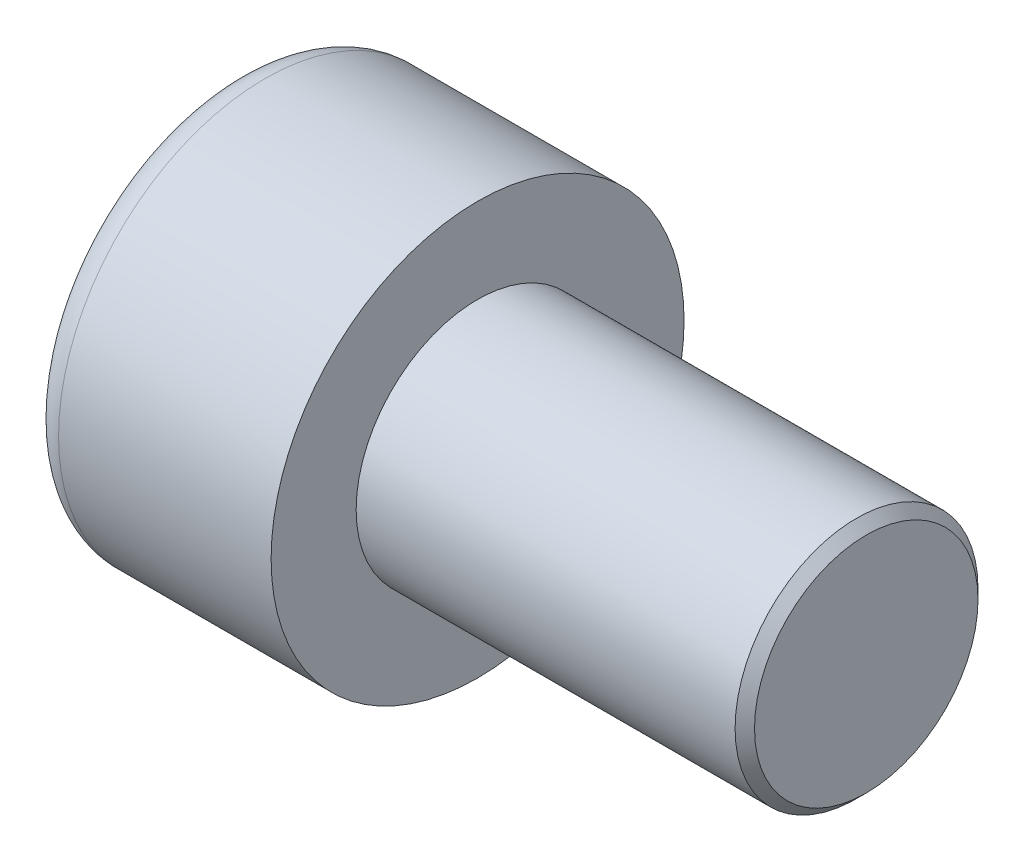
ISO-10303-21;
HEADER;
FILE_DESCRIPTION(('STEP AP214'),'2;1');
FILE_NAME('part.step','',(''),(''),'','','');
FILE_SCHEMA(('AUTOMOTIVE_DESIGN { 1 0 10303 214 1 1 1 1 }'));
ENDSEC;
DATA;
#1=APPLICATION_CONTEXT('core data for automotive mechanical design processes');
#2=APPLICATION_PROTOCOL_DEFINITION('international standard','automotive_design',2000,#1);
#3=PRODUCT_CONTEXT('',#1,'mechanical');
#4=PRODUCT('Part','Part','',(#3));
#5=PRODUCT_RELATED_PRODUCT_CATEGORY('part','',(#4));
#6=PRODUCT_DEFINITION_FORMATION('','',#4);
#7=PRODUCT_DEFINITION_CONTEXT('part definition',#1,'design');
#8=PRODUCT_DEFINITION('design','',#6,#7);
#9=PRODUCT_DEFINITION_SHAPE('','',#8);
#10=(LENGTH_UNIT() NAMED_UNIT(*) SI_UNIT(.MILLI.,.METRE.));
#11=(NAMED_UNIT(*) PLANE_ANGLE_UNIT() SI_UNIT($,.RADIAN.));
#12=(NAMED_UNIT(*) SI_UNIT($,.STERADIAN.) SOLID_ANGLE_UNIT());
#13=UNCERTAINTY_MEASURE_WITH_UNIT(LENGTH_MEASURE(1.E-05),#10,'distance_accuracy_value','');
#14=(GEOMETRIC_REPRESENTATION_CONTEXT(3) GLOBAL_UNCERTAINTY_ASSIGNED_CONTEXT((#13)) GLOBAL_UNIT_ASSIGNED_CONTEXT((#10,
#11,#12)) REPRESENTATION_CONTEXT('',''));
#15=CARTESIAN_POINT('',(0.,0.,0.));
#16=DIRECTION('',(0.,0.,1.));
#17=DIRECTION('',(1.,0.,0.));
#18=AXIS2_PLACEMENT_3D('',#15,#16,#17);
#19=CARTESIAN_POINT('',(2.5,0.,-2.3094010767585));
#20=DIRECTION('',(1.,0.,0.));
#21=DIRECTION('',(0.,0.,-1.));
#22=AXIS2_PLACEMENT_3D('',#19,#20,#21);
#23=PLANE('',#22);
#24=DIRECTION('',(0.,0.,-1.));
#25=VECTOR('',#24,1.);
#26=CARTESIAN_POINT('',(2.5,2.,-2.3094010767585));
#27=LINE('',#26,#25);
#28=CARTESIAN_POINT('',(2.5,2.,-1.15470053837925));
#29=VERTEX_POINT('',#28);
#30=CARTESIAN_POINT('',(2.49999999999886,2.00000000000477,0.));
#31=VERTEX_POINT('',#30);
#32=EDGE_CURVE('E80',#29,#31,#27,.F.);
#33=ORIENTED_EDGE('',*,*,#32,.F.);
#34=DIRECTION('',(0.,0.866025403784438,0.5));
#35=VECTOR('',#34,1.);
#36=CARTESIAN_POINT('',(2.5,1.,-1.73205080756888));
#37=LINE('',#36,#35);
#38=CARTESIAN_POINT('',(2.49999999999886,1.00000000000239,-1.73205080757301));
#39=VERTEX_POINT('',#38);
#40=EDGE_CURVE('E103',#39,#29,#37,.T.);
#41=ORIENTED_EDGE('',*,*,#40,.F.);
#42=CARTESIAN_POINT('',(2.49999999999773,0.,0.));
#43=DIRECTION('',(-1.,0.,0.));
#44=DIRECTION('',(0.,0.,1.));
#45=AXIS2_PLACEMENT_3D('',#42,#43,#44);
#46=CIRCLE('',#45,2.00000000000955);
#47=EDGE_CURVE('E111',#39,#31,#46,.F.);
#48=ORIENTED_EDGE('',*,*,#47,.T.);
#49=EDGE_LOOP('',(#33,#41,#48));
#50=FACE_BOUND('',#49,.T.);
#51=ADVANCED_FACE('F16',(#50),#23,.F.);
#52=CARTESIAN_POINT('',(2.5,0.,-2.3094010767585));
#53=DIRECTION('',(1.,0.,0.));
#54=DIRECTION('',(0.,0.,-1.));
#55=AXIS2_PLACEMENT_3D('',#52,#53,#54);
#56=PLANE('',#55);
#57=DIRECTION('',(0.,-0.866025403784439,0.5));
#58=VECTOR('',#57,1.);
#59=CARTESIAN_POINT('',(2.5,2.,1.15470053837925));
#60=LINE('',#59,#58);
#61=CARTESIAN_POINT('',(2.5,2.,1.15470053837925));
#62=VERTEX_POINT('',#61);
#63=CARTESIAN_POINT('',(2.49999999999886,1.00000000000239,1.73205080757301));
#64=VERTEX_POINT('',#63);
#65=EDGE_CURVE('E278',#62,#64,#60,.T.);
#66=ORIENTED_EDGE('',*,*,#65,.F.);
#67=DIRECTION('',(0.,0.,-1.));
#68=VECTOR('',#67,1.);
#69=CARTESIAN_POINT('',(2.5,2.,-2.3094010767585));
#70=LINE('',#69,#68);
#71=EDGE_CURVE('E282',#31,#62,#70,.F.);
#72=ORIENTED_EDGE('',*,*,#71,.F.);
#73=CARTESIAN_POINT('',(2.49999999999773,0.,0.));
#74=DIRECTION('',(-1.,0.,0.));
#75=DIRECTION('',(0.,0.,1.));
#76=AXIS2_PLACEMENT_3D('',#73,#74,#75);
#77=CIRCLE('',#76,2.00000000000955);
#78=EDGE_CURVE('E117',#31,#64,#77,.F.);
#79=ORIENTED_EDGE('',*,*,#78,.T.);
#80=EDGE_LOOP('',(#66,#72,#79));
#81=FACE_BOUND('',#80,.T.);
#82=ADVANCED_FACE('F323',(#81),#56,.F.);
#83=CARTESIAN_POINT('',(2.5,0.,-2.3094010767585));
#84=DIRECTION('',(1.,0.,0.));
#85=DIRECTION('',(0.,0.,-1.));
#86=AXIS2_PLACEMENT_3D('',#83,#84,#85);
#87=PLANE('',#86);
#88=DIRECTION('',(0.,0.866025403784439,-0.5));
#89=VECTOR('',#88,1.);
#90=CARTESIAN_POINT('',(2.5,-2.,-1.15470053837925));
#91=LINE('',#90,#89);
#92=CARTESIAN_POINT('',(2.5,-2.,-1.15470053837925));
#93=VERTEX_POINT('',#92);
#94=CARTESIAN_POINT('',(2.49999999999886,-1.00000000000239,-1.73205080757301));
#95=VERTEX_POINT('',#94);
#96=EDGE_CURVE('E118',#93,#95,#91,.T.);
#97=ORIENTED_EDGE('',*,*,#96,.F.);
#98=DIRECTION('',(0.,0.,-1.));
#99=VECTOR('',#98,1.);
#100=CARTESIAN_POINT('',(2.5,-2.,-2.3094010767585));
#101=LINE('',#100,#99);
#102=CARTESIAN_POINT('',(2.49999999999886,-2.00000000000477,0.));
#103=VERTEX_POINT('',#102);
#104=EDGE_CURVE('E122',#103,#93,#101,.T.);
#105=ORIENTED_EDGE('',*,*,#104,.F.);
#106=CARTESIAN_POINT('',(2.49999999999773,0.,0.));
#107=DIRECTION('',(-1.,0.,0.));
#108=DIRECTION('',(0.,0.,1.));
#109=AXIS2_PLACEMENT_3D('',#106,#107,#108);
#110=CIRCLE('',#109,2.00000000000955);
#111=EDGE_CURVE('E97',#103,#95,#110,.F.);
#112=ORIENTED_EDGE('',*,*,#111,.T.);
#113=EDGE_LOOP('',(#97,#105,#112));
#114=FACE_BOUND('',#113,.T.);
#115=ADVANCED_FACE('F335',(#114),#87,.F.);
#116=CARTESIAN_POINT('',(2.49999999999773,0.,0.));
#117=DIRECTION('',(-1.,0.,0.));
#118=DIRECTION('',(0.,0.,1.));
#119=AXIS2_PLACEMENT_3D('',#116,#117,#118);
#120=CONICAL_SURFACE('',#119,2.00000000000955,1.04719755114751);
#121=CARTESIAN_POINT('',(3.65470053836248,0.,0.));
#122=VERTEX_POINT('',#121);
#123=VERTEX_LOOP('',#122);
#124=FACE_BOUND('',#123,.T.);
#125=ORIENTED_EDGE('',*,*,#47,.F.);
#126=CARTESIAN_POINT('',(2.49999999999773,0.,0.));
#127=DIRECTION('',(-1.,0.,0.));
#128=DIRECTION('',(0.,0.,1.));
#129=AXIS2_PLACEMENT_3D('',#126,#127,#128);
#130=CIRCLE('',#129,2.00000000000955);
#131=EDGE_CURVE('E86',#95,#39,#130,.F.);
#132=ORIENTED_EDGE('',*,*,#131,.F.);
#133=ORIENTED_EDGE('',*,*,#111,.F.);
#134=CARTESIAN_POINT('',(2.49999999999773,0.,0.));
#135=DIRECTION('',(-1.,0.,0.));
#136=DIRECTION('',(0.,0.,1.));
#137=AXIS2_PLACEMENT_3D('',#134,#135,#136);
#138=CIRCLE('',#137,2.00000000000955);
#139=CARTESIAN_POINT('',(2.49999999999886,-1.00000000000239,1.73205080757301));
#140=VERTEX_POINT('',#139);
#141=EDGE_CURVE('E96',#103,#140,#138,.T.);
#142=ORIENTED_EDGE('',*,*,#141,.T.);
#143=CARTESIAN_POINT('',(2.49999999999773,0.,0.));
#144=DIRECTION('',(-1.,0.,0.));
#145=DIRECTION('',(0.,0.,1.));
#146=AXIS2_PLACEMENT_3D('',#143,#144,#145);
#147=CIRCLE('',#146,2.00000000000955);
#148=EDGE_CURVE('E120',#64,#140,#147,.F.);
#149=ORIENTED_EDGE('',*,*,#148,.F.);
#150=ORIENTED_EDGE('',*,*,#78,.F.);
#151=EDGE_LOOP('',(#125,#132,#133,#142,#149,#150));
#152=FACE_BOUND('',#151,.T.);
#153=ADVANCED_FACE('F115',(#124,#152),#120,.F.);
#154=CARTESIAN_POINT('',(2.5,0.,-2.3094010767585));
#155=DIRECTION('',(1.,0.,0.));
#156=DIRECTION('',(0.,0.,-1.));
#157=AXIS2_PLACEMENT_3D('',#154,#155,#156);
#158=PLANE('',#157);
#159=DIRECTION('',(0.,0.,1.));
#160=VECTOR('',#159,1.);
#161=CARTESIAN_POINT('',(2.5,-2.,1.15470053837925));
#162=LINE('',#161,#160);
#163=CARTESIAN_POINT('',(2.5,-2.,1.15470053837925));
#164=VERTEX_POINT('',#163);
#165=EDGE_CURVE('E233',#164,#103,#162,.F.);
#166=ORIENTED_EDGE('',*,*,#165,.F.);
#167=DIRECTION('',(0.,0.866025403784439,0.5));
#168=VECTOR('',#167,1.);
#169=CARTESIAN_POINT('',(2.5,0.,2.3094010767585));
#170=LINE('',#169,#168);
#171=EDGE_CURVE('E250',#140,#164,#170,.F.);
#172=ORIENTED_EDGE('',*,*,#171,.F.);
#173=ORIENTED_EDGE('',*,*,#141,.F.);
#174=EDGE_LOOP('',(#166,#172,#173));
#175=FACE_BOUND('',#174,.T.);
#176=ADVANCED_FACE('F251',(#175),#158,.F.);
#177=CARTESIAN_POINT('',(2.5,0.,-2.3094010767585));
#178=DIRECTION('',(1.,0.,0.));
#179=DIRECTION('',(0.,0.,-1.));
#180=AXIS2_PLACEMENT_3D('',#177,#178,#179);
#181=PLANE('',#180);
#182=DIRECTION('',(0.,0.866025403784439,0.5));
#183=VECTOR('',#182,1.);
#184=CARTESIAN_POINT('',(2.5,0.,2.3094010767585));
#185=LINE('',#184,#183);
#186=CARTESIAN_POINT('',(2.5,0.,2.3094010767585));
#187=VERTEX_POINT('',#186);
#188=EDGE_CURVE('E240',#187,#140,#185,.F.);
#189=ORIENTED_EDGE('',*,*,#188,.F.);
#190=DIRECTION('',(0.,0.866025403784439,-0.5));
#191=VECTOR('',#190,1.);
#192=CARTESIAN_POINT('',(2.5,2.,1.15470053837925));
#193=LINE('',#192,#191);
#194=EDGE_CURVE('E243',#64,#187,#193,.F.);
#195=ORIENTED_EDGE('',*,*,#194,.F.);
#196=ORIENTED_EDGE('',*,*,#148,.T.);
#197=EDGE_LOOP('',(#189,#195,#196));
#198=FACE_BOUND('',#197,.T.);
#199=ADVANCED_FACE('F238',(#198),#181,.F.);
#200=CARTESIAN_POINT('',(2.5,0.,-2.3094010767585));
#201=DIRECTION('',(1.,0.,0.));
#202=DIRECTION('',(0.,0.,-1.));
#203=AXIS2_PLACEMENT_3D('',#200,#201,#202);
#204=PLANE('',#203);
#205=DIRECTION('',(0.,-0.866025403784438,-0.5));
#206=VECTOR('',#205,1.);
#207=CARTESIAN_POINT('',(2.5,0.,-2.3094010767585));
#208=LINE('',#207,#206);
#209=CARTESIAN_POINT('',(2.5,0.,-2.3094010767585));
#210=VERTEX_POINT('',#209);
#211=EDGE_CURVE('E89',#210,#39,#208,.F.);
#212=ORIENTED_EDGE('',*,*,#211,.F.);
#213=DIRECTION('',(0.,-0.866025403784439,0.5));
#214=VECTOR('',#213,1.);
#215=CARTESIAN_POINT('',(2.5,-2.,-1.15470053837925));
#216=LINE('',#215,#214);
#217=EDGE_CURVE('E92',#95,#210,#216,.F.);
#218=ORIENTED_EDGE('',*,*,#217,.F.);
#219=ORIENTED_EDGE('',*,*,#131,.T.);
#220=EDGE_LOOP('',(#212,#218,#219));
#221=FACE_BOUND('',#220,.T.);
#222=ADVANCED_FACE('F88',(#221),#204,.F.);
#223=CARTESIAN_POINT('',(2.5,-2.,1.15470053837925));
#224=DIRECTION('',(0.,1.,0.));
#225=DIRECTION('',(0.,0.,1.));
#226=AXIS2_PLACEMENT_3D('',#223,#224,#225);
#227=PLANE('',#226);
#228=ORIENTED_EDGE('',*,*,#104,.T.);
#229=DIRECTION('',(1.,0.,0.));
#230=VECTOR('',#229,1.);
#231=CARTESIAN_POINT('',(2.5,-2.,-1.15470053837925));
#232=LINE('',#231,#230);
#233=CARTESIAN_POINT('',(0.,-2.,-1.15470053837925));
#234=VERTEX_POINT('',#233);
#235=EDGE_CURVE('E293',#234,#93,#232,.T.);
#236=ORIENTED_EDGE('',*,*,#235,.F.);
#237=DIRECTION('',(0.,0.,-1.));
#238=VECTOR('',#237,1.);
#239=CARTESIAN_POINT('',(0.,-2.,0.));
#240=LINE('',#239,#238);
#241=CARTESIAN_POINT('',(0.,-2.,1.15470053837925));
#242=VERTEX_POINT('',#241);
#243=EDGE_CURVE('E153',#234,#242,#240,.F.);
#244=ORIENTED_EDGE('',*,*,#243,.T.);
#245=DIRECTION('',(1.,0.,0.));
#246=VECTOR('',#245,1.);
#247=CARTESIAN_POINT('',(2.5,-2.,1.15470053837925));
#248=LINE('',#247,#246);
#249=EDGE_CURVE('E255',#164,#242,#248,.F.);
#250=ORIENTED_EDGE('',*,*,#249,.F.);
#251=ORIENTED_EDGE('',*,*,#165,.T.);
#252=EDGE_LOOP('',(#228,#236,#244,#250,#251));
#253=FACE_BOUND('',#252,.T.);
#254=ADVANCED_FACE('F316',(#253),#227,.T.);
#255=CARTESIAN_POINT('',(2.5,0.,2.3094010767585));
#256=DIRECTION('',(0.,0.5,-0.866025403784439));
#257=DIRECTION('',(0.,0.866025403784439,0.5));
#258=AXIS2_PLACEMENT_3D('',#255,#256,#257);
#259=PLANE('',#258);
#260=ORIENTED_EDGE('',*,*,#171,.T.);
#261=ORIENTED_EDGE('',*,*,#249,.T.);
#262=DIRECTION('',(0.,0.866025403784438,0.5));
#263=VECTOR('',#262,1.);
#264=CARTESIAN_POINT('',(0.,-2.,1.15470053837925));
#265=LINE('',#264,#263);
#266=CARTESIAN_POINT('',(0.,0.,2.3094010767585));
#267=VERTEX_POINT('',#266);
#268=EDGE_CURVE('E150',#242,#267,#265,.T.);
#269=ORIENTED_EDGE('',*,*,#268,.T.);
#270=DIRECTION('',(1.,0.,0.));
#271=VECTOR('',#270,1.);
#272=CARTESIAN_POINT('',(2.5,0.,2.3094010767585));
#273=LINE('',#272,#271);
#274=EDGE_CURVE('E259',#187,#267,#273,.F.);
#275=ORIENTED_EDGE('',*,*,#274,.F.);
#276=ORIENTED_EDGE('',*,*,#188,.T.);
#277=EDGE_LOOP('',(#260,#261,#269,#275,#276));
#278=FACE_BOUND('',#277,.T.);
#279=ADVANCED_FACE('F257',(#278),#259,.T.);
#280=CARTESIAN_POINT('',(2.5,2.,1.15470053837925));
#281=DIRECTION('',(0.,-0.5,-0.866025403784439));
#282=DIRECTION('',(0.,0.866025403784439,-0.5));
#283=AXIS2_PLACEMENT_3D('',#280,#281,#282);
#284=PLANE('',#283);
#285=ORIENTED_EDGE('',*,*,#194,.T.);
#286=ORIENTED_EDGE('',*,*,#274,.T.);
#287=DIRECTION('',(0.,0.866025403784438,-0.5));
#288=VECTOR('',#287,1.);
#289=CARTESIAN_POINT('',(0.,0.,2.3094010767585));
#290=LINE('',#289,#288);
#291=CARTESIAN_POINT('',(0.,2.,1.15470053837925));
#292=VERTEX_POINT('',#291);
#293=EDGE_CURVE('E147',#267,#292,#290,.T.);
#294=ORIENTED_EDGE('',*,*,#293,.T.);
#295=DIRECTION('',(1.,0.,0.));
#296=VECTOR('',#295,1.);
#297=CARTESIAN_POINT('',(2.5,2.,1.15470053837925));
#298=LINE('',#297,#296);
#299=EDGE_CURVE('E108',#62,#292,#298,.F.);
#300=ORIENTED_EDGE('',*,*,#299,.F.);
#301=ORIENTED_EDGE('',*,*,#65,.T.);
#302=EDGE_LOOP('',(#285,#286,#294,#300,#301));
#303=FACE_BOUND('',#302,.T.);
#304=ADVANCED_FACE('F319',(#303),#284,.T.);
#305=CARTESIAN_POINT('',(2.5,2.,-1.15470053837925));
#306=DIRECTION('',(0.,-1.,0.));
#307=DIRECTION('',(0.,0.,-1.));
#308=AXIS2_PLACEMENT_3D('',#305,#306,#307);
#309=PLANE('',#308);
#310=ORIENTED_EDGE('',*,*,#71,.T.);
#311=ORIENTED_EDGE('',*,*,#299,.T.);
#312=DIRECTION('',(0.,0.,-1.));
#313=VECTOR('',#312,1.);
#314=CARTESIAN_POINT('',(0.,2.,0.));
#315=LINE('',#314,#313);
#316=CARTESIAN_POINT('',(0.,2.,-1.15470053837925));
#317=VERTEX_POINT('',#316);
#318=EDGE_CURVE('E138',#292,#317,#315,.T.);
#319=ORIENTED_EDGE('',*,*,#318,.T.);
#320=DIRECTION('',(1.,0.,0.));
#321=VECTOR('',#320,1.);
#322=CARTESIAN_POINT('',(2.5,2.,-1.15470053837925));
#323=LINE('',#322,#321);
#324=EDGE_CURVE('E107',#29,#317,#323,.F.);
#325=ORIENTED_EDGE('',*,*,#324,.F.);
#326=ORIENTED_EDGE('',*,*,#32,.T.);
#327=EDGE_LOOP('',(#310,#311,#319,#325,#326));
#328=FACE_BOUND('',#327,.T.);
#329=ADVANCED_FACE('F321',(#328),#309,.T.);
#330=CARTESIAN_POINT('',(2.5,0.,-2.3094010767585));
#331=DIRECTION('',(0.,-0.5,0.866025403784438));
#332=DIRECTION('',(0.,-0.866025403784438,-0.5));
#333=AXIS2_PLACEMENT_3D('',#330,#331,#332);
#334=PLANE('',#333);
#335=ORIENTED_EDGE('',*,*,#40,.T.);
#336=ORIENTED_EDGE('',*,*,#324,.T.);
#337=DIRECTION('',(0.,-0.866025403784438,-0.500000000000001));
#338=VECTOR('',#337,1.);
#339=CARTESIAN_POINT('',(0.,2.,-1.15470053837925));
#340=LINE('',#339,#338);
#341=CARTESIAN_POINT('',(0.,0.,-2.3094010767585));
#342=VERTEX_POINT('',#341);
#343=EDGE_CURVE('E132',#317,#342,#340,.T.);
#344=ORIENTED_EDGE('',*,*,#343,.T.);
#345=DIRECTION('',(1.,0.,0.));
#346=VECTOR('',#345,1.);
#347=CARTESIAN_POINT('',(2.5,0.,-2.3094010767585));
#348=LINE('',#347,#346);
#349=EDGE_CURVE('E106',#210,#342,#348,.F.);
#350=ORIENTED_EDGE('',*,*,#349,.F.);
#351=ORIENTED_EDGE('',*,*,#211,.T.);
#352=EDGE_LOOP('',(#335,#336,#344,#350,#351));
#353=FACE_BOUND('',#352,.T.);
#354=ADVANCED_FACE('F101',(#353),#334,.T.);
#355=CARTESIAN_POINT('',(2.5,-2.,-1.15470053837925));
#356=DIRECTION('',(0.,0.5,0.866025403784439));
#357=DIRECTION('',(0.,-0.866025403784439,0.5));
#358=AXIS2_PLACEMENT_3D('',#355,#356,#357);
#359=PLANE('',#358);
#360=ORIENTED_EDGE('',*,*,#217,.T.);
#361=ORIENTED_EDGE('',*,*,#349,.T.);
#362=DIRECTION('',(0.,-0.866025403784439,0.5));
#363=VECTOR('',#362,1.);
#364=CARTESIAN_POINT('',(0.,0.,-2.3094010767585));
#365=LINE('',#364,#363);
#366=EDGE_CURVE('E129',#342,#234,#365,.T.);
#367=ORIENTED_EDGE('',*,*,#366,.T.);
#368=ORIENTED_EDGE('',*,*,#235,.T.);
#369=ORIENTED_EDGE('',*,*,#96,.T.);
#370=EDGE_LOOP('',(#360,#361,#367,#368,#369));
#371=FACE_BOUND('',#370,.T.);
#372=ADVANCED_FACE('F189',(#371),#359,.T.);
#373=CARTESIAN_POINT('',(0.,0.,0.));
#374=DIRECTION('',(1.,0.,0.));
#375=DIRECTION('',(0.,0.,-1.));
#376=AXIS2_PLACEMENT_3D('',#373,#374,#375);
#377=PLANE('',#376);
#378=ORIENTED_EDGE('',*,*,#343,.F.);
#379=ORIENTED_EDGE('',*,*,#318,.F.);
#380=ORIENTED_EDGE('',*,*,#293,.F.);
#381=ORIENTED_EDGE('',*,*,#268,.F.);
#382=ORIENTED_EDGE('',*,*,#243,.F.);
#383=ORIENTED_EDGE('',*,*,#366,.F.);
#384=EDGE_LOOP('',(#378,#379,#380,#381,#382,#383));
#385=FACE_BOUND('',#384,.T.);
#386=CARTESIAN_POINT('',(0.,0.,0.));
#387=DIRECTION('',(1.,0.,0.));
#388=DIRECTION('',(0.,0.,-1.));
#389=AXIS2_PLACEMENT_3D('',#386,#387,#388);
#390=CIRCLE('',#389,3.625);
#391=CARTESIAN_POINT('',(0.,0.,-3.625));
#392=VERTEX_POINT('',#391);
#393=CARTESIAN_POINT('',(0.,0.,3.625));
#394=VERTEX_POINT('',#393);
#395=EDGE_CURVE('E127',#392,#394,#390,.T.);
#396=ORIENTED_EDGE('',*,*,#395,.F.);
#397=CARTESIAN_POINT('',(0.,0.,0.));
#398=DIRECTION('',(1.,0.,0.));
#399=DIRECTION('',(0.,0.,1.));
#400=AXIS2_PLACEMENT_3D('',#397,#398,#399);
#401=CIRCLE('',#400,3.625);
#402=EDGE_CURVE('E35',#394,#392,#401,.T.);
#403=ORIENTED_EDGE('',*,*,#402,.F.);
#404=EDGE_LOOP('',(#396,#403));
#405=FACE_BOUND('',#404,.T.);
#406=ADVANCED_FACE('F170',(#385,#405),#377,.F.);
#407=CARTESIAN_POINT('',(0.625,0.,0.));
#408=DIRECTION('',(1.,0.,0.));
#409=DIRECTION('',(0.,0.,-1.));
#410=AXIS2_PLACEMENT_3D('',#407,#408,#409);
#411=TOROIDAL_SURFACE('',#410,3.625,0.625);
#412=CARTESIAN_POINT('',(0.625,0.,0.));
#413=DIRECTION('',(-1.,0.,0.));
#414=DIRECTION('',(0.,0.,1.));
#415=AXIS2_PLACEMENT_3D('',#412,#413,#414);
#416=CIRCLE('',#415,4.25);
#417=CARTESIAN_POINT('',(0.625,0.,4.25));
#418=VERTEX_POINT('',#417);
#419=EDGE_CURVE('E130',#418,#418,#416,.F.);
#420=ORIENTED_EDGE('',*,*,#419,.F.);
#421=EDGE_LOOP('',(#420));
#422=FACE_BOUND('',#421,.T.);
#423=ORIENTED_EDGE('',*,*,#395,.T.);
#424=ORIENTED_EDGE('',*,*,#402,.T.);
#425=EDGE_LOOP('',(#423,#424));
#426=FACE_BOUND('',#425,.T.);
#427=ADVANCED_FACE('F126',(#422,#426),#411,.T.);
#428=CARTESIAN_POINT('',(13.,0.,0.));
#429=DIRECTION('',(1.,0.,0.));
#430=DIRECTION('',(0.,0.,-1.));
#431=AXIS2_PLACEMENT_3D('',#428,#429,#430);
#432=PLANE('',#431);
#433=CARTESIAN_POINT('',(13.0000000000337,0.,0.));
#434=DIRECTION('',(-1.,0.,0.));
#435=DIRECTION('',(0.,0.,1.));
#436=AXIS2_PLACEMENT_3D('',#433,#434,#435);
#437=CIRCLE('',#436,2.29999999993424);
#438=CARTESIAN_POINT('',(13.0000000000337,0.,2.29999999993424));
#439=VERTEX_POINT('',#438);
#440=EDGE_CURVE('E225',#439,#439,#437,.T.);
#441=ORIENTED_EDGE('',*,*,#440,.F.);
#442=EDGE_LOOP('',(#441));
#443=FACE_BOUND('',#442,.T.);
#444=ADVANCED_FACE('F169',(#443),#432,.T.);
#445=CARTESIAN_POINT('',(5.,0.,0.));
#446=DIRECTION('',(-1.,0.,0.));
#447=DIRECTION('',(0.,0.,1.));
#448=AXIS2_PLACEMENT_3D('',#445,#446,#447);
#449=CYLINDRICAL_SURFACE('',#448,4.25);
#450=ORIENTED_EDGE('',*,*,#419,.T.);
#451=EDGE_LOOP('',(#450));
#452=FACE_BOUND('',#451,.T.);
#453=CARTESIAN_POINT('',(5.,0.,0.));
#454=DIRECTION('',(-1.,0.,0.));
#455=DIRECTION('',(0.,0.,1.));
#456=AXIS2_PLACEMENT_3D('',#453,#454,#455);
#457=CIRCLE('',#456,4.25);
#458=CARTESIAN_POINT('',(5.,0.,4.25));
#459=VERTEX_POINT('',#458);
#460=EDGE_CURVE('E224',#459,#459,#457,.F.);
#461=ORIENTED_EDGE('',*,*,#460,.F.);
#462=EDGE_LOOP('',(#461));
#463=FACE_BOUND('',#462,.T.);
#464=ADVANCED_FACE('F211',(#452,#463),#449,.T.);
#465=CARTESIAN_POINT('',(12.8000000000839,0.,0.));
#466=DIRECTION('',(-1.,0.,0.));
#467=DIRECTION('',(0.,0.,1.));
#468=AXIS2_PLACEMENT_3D('',#465,#466,#467);
#469=CONICAL_SURFACE('',#468,2.49999999988404,0.785398163397448);
#470=CARTESIAN_POINT('',(12.8,0.,0.));
#471=DIRECTION('',(-1.,0.,0.));
#472=DIRECTION('',(0.,0.,1.));
#473=AXIS2_PLACEMENT_3D('',#470,#471,#472);
#474=CIRCLE('',#473,2.5);
#475=CARTESIAN_POINT('',(12.8,0.,2.5));
#476=VERTEX_POINT('',#475);
#477=EDGE_CURVE('E27',#476,#476,#474,.T.);
#478=ORIENTED_EDGE('',*,*,#477,.F.);
#479=EDGE_LOOP('',(#478));
#480=FACE_BOUND('',#479,.T.);
#481=ORIENTED_EDGE('',*,*,#440,.T.);
#482=EDGE_LOOP('',(#481));
#483=FACE_BOUND('',#482,.T.);
#484=ADVANCED_FACE('F205',(#480,#483),#469,.T.);
#485=CARTESIAN_POINT('',(5.,0.,0.));
#486=DIRECTION('',(1.,0.,0.));
#487=DIRECTION('',(0.,0.,-1.));
#488=AXIS2_PLACEMENT_3D('',#485,#486,#487);
#489=PLANE('',#488);
#490=ORIENTED_EDGE('',*,*,#460,.T.);
#491=EDGE_LOOP('',(#490));
#492=FACE_BOUND('',#491,.T.);
#493=CARTESIAN_POINT('',(5.,0.,0.));
#494=DIRECTION('',(-1.,0.,0.));
#495=DIRECTION('',(0.,0.,1.));
#496=AXIS2_PLACEMENT_3D('',#493,#494,#495);
#497=CIRCLE('',#496,2.5);
#498=CARTESIAN_POINT('',(5.,0.,2.5));
#499=VERTEX_POINT('',#498);
#500=EDGE_CURVE('E11',#499,#499,#497,.F.);
#501=ORIENTED_EDGE('',*,*,#500,.F.);
#502=EDGE_LOOP('',(#501));
#503=FACE_BOUND('',#502,.T.);
#504=ADVANCED_FACE('F198',(#492,#503),#489,.T.);
#505=CARTESIAN_POINT('',(13.,0.,0.));
#506=DIRECTION('',(-1.,0.,0.));
#507=DIRECTION('',(0.,0.,1.));
#508=AXIS2_PLACEMENT_3D('',#505,#506,#507);
#509=CYLINDRICAL_SURFACE('',#508,2.5);
#510=ORIENTED_EDGE('',*,*,#500,.T.);
#511=EDGE_LOOP('',(#510));
#512=FACE_BOUND('',#511,.T.);
#513=ORIENTED_EDGE('',*,*,#477,.T.);
#514=EDGE_LOOP('',(#513));
#515=FACE_BOUND('',#514,.T.);
#516=ADVANCED_FACE('F196',(#512,#515),#509,.T.);
#517=CLOSED_SHELL('',(#51,#82,#115,#153,#176,#199,#222,#254,#279,#304,#329,#354,#372,#406,#427,
#444,#464,#484,#504,#516));
#518=MANIFOLD_SOLID_BREP('B1',#517);
#519=ADVANCED_BREP_SHAPE_REPRESENTATION('',(#18,#518),#14);
#520=SHAPE_DEFINITION_REPRESENTATION(#9,#519);
ENDSEC;
END-ISO-10303-21;
